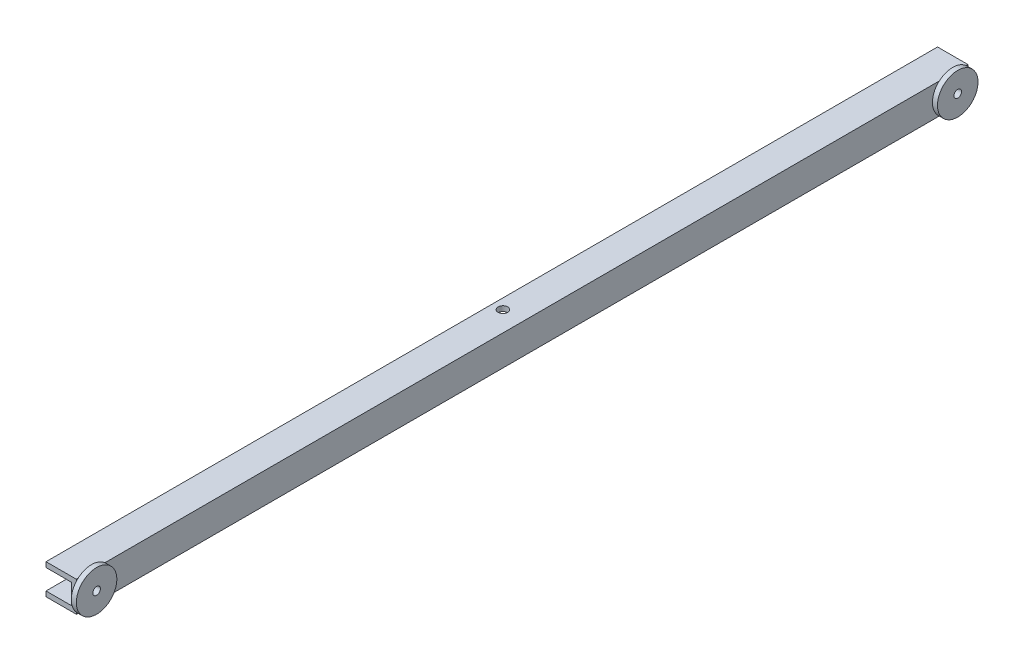
ISO-10303-21;
HEADER;
FILE_DESCRIPTION(('STEP AP214'),'2;1');
FILE_NAME('part.step','',(''),(''),'','','');
FILE_SCHEMA(('AUTOMOTIVE_DESIGN { 1 0 10303 214 1 1 1 1 }'));
ENDSEC;
DATA;
#1=APPLICATION_CONTEXT('core data for automotive mechanical design processes');
#2=APPLICATION_PROTOCOL_DEFINITION('international standard','automotive_design',2000,#1);
#3=PRODUCT_CONTEXT('',#1,'mechanical');
#4=PRODUCT('Part','Part','',(#3));
#5=PRODUCT_RELATED_PRODUCT_CATEGORY('part','',(#4));
#6=PRODUCT_DEFINITION_FORMATION('','',#4);
#7=PRODUCT_DEFINITION_CONTEXT('part definition',#1,'design');
#8=PRODUCT_DEFINITION('design','',#6,#7);
#9=PRODUCT_DEFINITION_SHAPE('','',#8);
#10=(LENGTH_UNIT() NAMED_UNIT(*) SI_UNIT(.MILLI.,.METRE.));
#11=(NAMED_UNIT(*) PLANE_ANGLE_UNIT() SI_UNIT($,.RADIAN.));
#12=(NAMED_UNIT(*) SI_UNIT($,.STERADIAN.) SOLID_ANGLE_UNIT());
#13=UNCERTAINTY_MEASURE_WITH_UNIT(LENGTH_MEASURE(1.E-05),#10,'distance_accuracy_value','');
#14=(GEOMETRIC_REPRESENTATION_CONTEXT(3) GLOBAL_UNCERTAINTY_ASSIGNED_CONTEXT((#13)) GLOBAL_UNIT_ASSIGNED_CONTEXT((#10,
#11,#12)) REPRESENTATION_CONTEXT('',''));
#15=CARTESIAN_POINT('',(0.,0.,0.));
#16=DIRECTION('',(0.,0.,1.));
#17=DIRECTION('',(1.,0.,0.));
#18=AXIS2_PLACEMENT_3D('',#15,#16,#17);
#19=CARTESIAN_POINT('',(0.,-9.525,-558.8));
#20=DIRECTION('',(1.,0.,0.));
#21=DIRECTION('',(0.,0.,-1.));
#22=AXIS2_PLACEMENT_3D('',#19,#20,#21);
#23=PLANE('',#22);
#24=DIRECTION('',(0.,1.,0.));
#25=VECTOR('',#24,1.);
#26=CARTESIAN_POINT('',(0.,-9.525,-558.8));
#27=LINE('',#26,#25);
#28=CARTESIAN_POINT('',(0.,-9.525,-558.8));
#29=VERTEX_POINT('',#28);
#30=CARTESIAN_POINT('',(0.,-8.40026041263005,-558.8));
#31=VERTEX_POINT('',#30);
#32=EDGE_CURVE('E152',#29,#31,#27,.T.);
#33=ORIENTED_EDGE('',*,*,#32,.T.);
#34=CARTESIAN_POINT('',(0.,0.,-549.275));
#35=DIRECTION('',(1.,0.,0.));
#36=DIRECTION('',(0.,0.,-1.));
#37=AXIS2_PLACEMENT_3D('',#34,#35,#36);
#38=CIRCLE('',#37,12.7);
#39=CARTESIAN_POINT('',(0.,-9.525,-557.67526041263));
#40=VERTEX_POINT('',#39);
#41=EDGE_CURVE('E175',#40,#31,#38,.T.);
#42=ORIENTED_EDGE('',*,*,#41,.F.);
#43=DIRECTION('',(0.,0.,1.));
#44=VECTOR('',#43,1.);
#45=CARTESIAN_POINT('',(0.,-9.525,-558.8));
#46=LINE('',#45,#44);
#47=EDGE_CURVE('E257',#29,#40,#46,.T.);
#48=ORIENTED_EDGE('',*,*,#47,.F.);
#49=EDGE_LOOP('',(#33,#42,#48));
#50=FACE_BOUND('',#49,.T.);
#51=ADVANCED_FACE('F37',(#50),#23,.T.);
#52=CARTESIAN_POINT('',(0.,-9.525,-540.87473958737));
#53=VERTEX_POINT('',#52);
#54=CARTESIAN_POINT('',(0.,-9.525,-17.9252604126301));
#55=VERTEX_POINT('',#54);
#56=EDGE_CURVE('E261',#53,#55,#46,.T.);
#57=ORIENTED_EDGE('',*,*,#56,.F.);
#58=CARTESIAN_POINT('',(0.,9.525,-540.87473958737));
#59=VERTEX_POINT('',#58);
#60=EDGE_CURVE('E55',#59,#53,#38,.T.);
#61=ORIENTED_EDGE('',*,*,#60,.F.);
#62=DIRECTION('',(0.,0.,1.));
#63=VECTOR('',#62,1.);
#64=CARTESIAN_POINT('',(0.,9.525,-558.8));
#65=LINE('',#64,#63);
#66=CARTESIAN_POINT('',(0.,9.525,-17.9252604126301));
#67=VERTEX_POINT('',#66);
#68=EDGE_CURVE('E255',#59,#67,#65,.T.);
#69=ORIENTED_EDGE('',*,*,#68,.T.);
#70=CARTESIAN_POINT('',(0.,0.,-9.525));
#71=DIRECTION('',(1.,0.,0.));
#72=DIRECTION('',(0.,0.,-1.));
#73=AXIS2_PLACEMENT_3D('',#70,#71,#72);
#74=CIRCLE('',#73,12.7);
#75=EDGE_CURVE('E196',#55,#67,#74,.T.);
#76=ORIENTED_EDGE('',*,*,#75,.F.);
#77=EDGE_LOOP('',(#57,#61,#69,#76));
#78=FACE_BOUND('',#77,.T.);
#79=ADVANCED_FACE('F313',(#78),#23,.T.);
#80=CARTESIAN_POINT('',(0.,9.525,-558.8));
#81=VERTEX_POINT('',#80);
#82=CARTESIAN_POINT('',(0.,9.525,-557.67526041263));
#83=VERTEX_POINT('',#82);
#84=EDGE_CURVE('E158',#81,#83,#65,.T.);
#85=ORIENTED_EDGE('',*,*,#84,.T.);
#86=CARTESIAN_POINT('',(0.,8.40026041263007,-558.8));
#87=VERTEX_POINT('',#86);
#88=EDGE_CURVE('E156',#87,#83,#38,.T.);
#89=ORIENTED_EDGE('',*,*,#88,.F.);
#90=EDGE_CURVE('E141',#87,#81,#27,.T.);
#91=ORIENTED_EDGE('',*,*,#90,.T.);
#92=EDGE_LOOP('',(#85,#89,#91));
#93=FACE_BOUND('',#92,.T.);
#94=ADVANCED_FACE('F157',(#93),#23,.T.);
#95=CARTESIAN_POINT('',(0.,9.525,-1.12473958736992));
#96=VERTEX_POINT('',#95);
#97=CARTESIAN_POINT('',(0.,8.40026041263008,0.));
#98=VERTEX_POINT('',#97);
#99=EDGE_CURVE('E11',#96,#98,#74,.T.);
#100=ORIENTED_EDGE('',*,*,#99,.F.);
#101=CARTESIAN_POINT('',(0.,9.525,0.));
#102=VERTEX_POINT('',#101);
#103=EDGE_CURVE('E260',#96,#102,#65,.T.);
#104=ORIENTED_EDGE('',*,*,#103,.T.);
#105=DIRECTION('',(0.,1.,0.));
#106=VECTOR('',#105,1.);
#107=CARTESIAN_POINT('',(0.,-9.525,0.));
#108=LINE('',#107,#106);
#109=EDGE_CURVE('E245',#98,#102,#108,.T.);
#110=ORIENTED_EDGE('',*,*,#109,.F.);
#111=EDGE_LOOP('',(#100,#104,#110));
#112=FACE_BOUND('',#111,.T.);
#113=ADVANCED_FACE('F311',(#112),#23,.T.);
#114=CARTESIAN_POINT('',(0.,-8.40026041263008,0.));
#115=VERTEX_POINT('',#114);
#116=CARTESIAN_POINT('',(0.,-9.525,-1.12473958736992));
#117=VERTEX_POINT('',#116);
#118=EDGE_CURVE('E46',#115,#117,#74,.T.);
#119=ORIENTED_EDGE('',*,*,#118,.F.);
#120=CARTESIAN_POINT('',(0.,-9.525,0.));
#121=VERTEX_POINT('',#120);
#122=EDGE_CURVE('E246',#121,#115,#108,.T.);
#123=ORIENTED_EDGE('',*,*,#122,.F.);
#124=EDGE_CURVE('E265',#117,#121,#46,.T.);
#125=ORIENTED_EDGE('',*,*,#124,.F.);
#126=EDGE_LOOP('',(#119,#123,#125));
#127=FACE_BOUND('',#126,.T.);
#128=ADVANCED_FACE('F342',(#127),#23,.T.);
#129=CARTESIAN_POINT('',(-19.01,9.525,-558.8));
#130=DIRECTION('',(-1.,0.,0.));
#131=DIRECTION('',(0.,-1.,0.));
#132=AXIS2_PLACEMENT_3D('',#129,#130,#131);
#133=PLANE('',#132);
#134=DIRECTION('',(0.,-1.,0.));
#135=VECTOR('',#134,1.);
#136=CARTESIAN_POINT('',(-19.01,9.525,0.));
#137=LINE('',#136,#135);
#138=CARTESIAN_POINT('',(-19.01,9.525,0.));
#139=VERTEX_POINT('',#138);
#140=CARTESIAN_POINT('',(-19.01,6.35,0.));
#141=VERTEX_POINT('',#140);
#142=EDGE_CURVE('E207',#139,#141,#137,.T.);
#143=ORIENTED_EDGE('',*,*,#142,.F.);
#144=DIRECTION('',(0.,0.,1.));
#145=VECTOR('',#144,1.);
#146=CARTESIAN_POINT('',(-19.01,9.525,-558.8));
#147=LINE('',#146,#145);
#148=CARTESIAN_POINT('',(-19.01,9.525,-558.8));
#149=VERTEX_POINT('',#148);
#150=EDGE_CURVE('E252',#149,#139,#147,.T.);
#151=ORIENTED_EDGE('',*,*,#150,.F.);
#152=DIRECTION('',(0.,-1.,0.));
#153=VECTOR('',#152,1.);
#154=CARTESIAN_POINT('',(-19.01,9.525,-558.8));
#155=LINE('',#154,#153);
#156=CARTESIAN_POINT('',(-19.01,6.35,-558.8));
#157=VERTEX_POINT('',#156);
#158=EDGE_CURVE('E208',#149,#157,#155,.T.);
#159=ORIENTED_EDGE('',*,*,#158,.T.);
#160=DIRECTION('',(0.,0.,1.));
#161=VECTOR('',#160,1.);
#162=CARTESIAN_POINT('',(-19.01,6.35,-558.8));
#163=LINE('',#162,#161);
#164=EDGE_CURVE('E227',#157,#141,#163,.T.);
#165=ORIENTED_EDGE('',*,*,#164,.T.);
#166=EDGE_LOOP('',(#143,#151,#159,#165));
#167=FACE_BOUND('',#166,.T.);
#168=ADVANCED_FACE('F39',(#167),#133,.T.);
#169=CARTESIAN_POINT('',(0.,9.525,-558.8));
#170=DIRECTION('',(0.,1.,0.));
#171=DIRECTION('',(0.,0.,1.));
#172=AXIS2_PLACEMENT_3D('',#169,#170,#171);
#173=PLANE('',#172);
#174=CARTESIAN_POINT('',(-12.66,9.525,-280.013576807965));
#175=DIRECTION('',(0.,1.,0.));
#176=DIRECTION('',(0.,0.,1.));
#177=AXIS2_PLACEMENT_3D('',#174,#175,#176);
#178=CIRCLE('',#177,3.);
#179=CARTESIAN_POINT('',(-12.66,9.525,-277.013576807965));
#180=VERTEX_POINT('',#179);
#181=EDGE_CURVE('E197',#180,#180,#178,.T.);
#182=ORIENTED_EDGE('',*,*,#181,.F.);
#183=EDGE_LOOP('',(#182));
#184=FACE_BOUND('',#183,.T.);
#185=DIRECTION('',(-1.,0.,0.));
#186=VECTOR('',#185,1.);
#187=CARTESIAN_POINT('',(0.,9.525,0.));
#188=LINE('',#187,#186);
#189=EDGE_CURVE('E212',#102,#139,#188,.T.);
#190=ORIENTED_EDGE('',*,*,#189,.F.);
#191=ORIENTED_EDGE('',*,*,#103,.F.);
#192=EDGE_CURVE('E256',#67,#96,#65,.T.);
#193=ORIENTED_EDGE('',*,*,#192,.F.);
#194=ORIENTED_EDGE('',*,*,#68,.F.);
#195=DIRECTION('',(0.,0.,-1.));
#196=VECTOR('',#195,1.);
#197=CARTESIAN_POINT('',(0.,9.525,-558.8));
#198=LINE('',#197,#196);
#199=EDGE_CURVE('E62',#59,#83,#198,.T.);
#200=ORIENTED_EDGE('',*,*,#199,.T.);
#201=ORIENTED_EDGE('',*,*,#84,.F.);
#202=DIRECTION('',(-1.,0.,0.));
#203=VECTOR('',#202,1.);
#204=CARTESIAN_POINT('',(0.,9.525,-558.8));
#205=LINE('',#204,#203);
#206=EDGE_CURVE('E150',#81,#149,#205,.T.);
#207=ORIENTED_EDGE('',*,*,#206,.T.);
#208=ORIENTED_EDGE('',*,*,#150,.T.);
#209=EDGE_LOOP('',(#190,#191,#193,#194,#200,#201,#207,#208));
#210=FACE_BOUND('',#209,.T.);
#211=ADVANCED_FACE('F302',(#184,#210),#173,.T.);
#212=CARTESIAN_POINT('',(0.,-9.525,-558.8));
#213=DIRECTION('',(0.,-1.,0.));
#214=DIRECTION('',(0.,0.,-1.));
#215=AXIS2_PLACEMENT_3D('',#212,#213,#214);
#216=PLANE('',#215);
#217=CARTESIAN_POINT('',(-12.66,-9.52500000000001,-280.013576807965));
#218=DIRECTION('',(0.,-1.,0.));
#219=DIRECTION('',(0.,0.,-1.));
#220=AXIS2_PLACEMENT_3D('',#217,#218,#219);
#221=CIRCLE('',#220,3.);
#222=CARTESIAN_POINT('',(-12.66,-9.52500000000001,-283.013576807965));
#223=VERTEX_POINT('',#222);
#224=EDGE_CURVE('E204',#223,#223,#221,.T.);
#225=ORIENTED_EDGE('',*,*,#224,.F.);
#226=EDGE_LOOP('',(#225));
#227=FACE_BOUND('',#226,.T.);
#228=DIRECTION('',(1.,0.,0.));
#229=VECTOR('',#228,1.);
#230=CARTESIAN_POINT('',(0.,-9.525,0.));
#231=LINE('',#230,#229);
#232=CARTESIAN_POINT('',(-19.01,-9.525,0.));
#233=VERTEX_POINT('',#232);
#234=EDGE_CURVE('E242',#233,#121,#231,.T.);
#235=ORIENTED_EDGE('',*,*,#234,.F.);
#236=DIRECTION('',(0.,0.,1.));
#237=VECTOR('',#236,1.);
#238=CARTESIAN_POINT('',(-19.01,-9.525,-558.8));
#239=LINE('',#238,#237);
#240=CARTESIAN_POINT('',(-19.01,-9.525,-558.8));
#241=VERTEX_POINT('',#240);
#242=EDGE_CURVE('E263',#241,#233,#239,.T.);
#243=ORIENTED_EDGE('',*,*,#242,.F.);
#244=DIRECTION('',(1.,0.,0.));
#245=VECTOR('',#244,1.);
#246=CARTESIAN_POINT('',(0.,-9.525,-558.8));
#247=LINE('',#246,#245);
#248=EDGE_CURVE('E153',#241,#29,#247,.T.);
#249=ORIENTED_EDGE('',*,*,#248,.T.);
#250=ORIENTED_EDGE('',*,*,#47,.T.);
#251=DIRECTION('',(0.,0.,1.));
#252=VECTOR('',#251,1.);
#253=CARTESIAN_POINT('',(0.,-9.525,-558.8));
#254=LINE('',#253,#252);
#255=EDGE_CURVE('E171',#40,#53,#254,.T.);
#256=ORIENTED_EDGE('',*,*,#255,.T.);
#257=ORIENTED_EDGE('',*,*,#56,.T.);
#258=EDGE_CURVE('E262',#55,#117,#46,.T.);
#259=ORIENTED_EDGE('',*,*,#258,.T.);
#260=ORIENTED_EDGE('',*,*,#124,.T.);
#261=EDGE_LOOP('',(#235,#243,#249,#250,#256,#257,#259,#260));
#262=FACE_BOUND('',#261,.T.);
#263=ADVANCED_FACE('F360',(#227,#262),#216,.T.);
#264=CARTESIAN_POINT('',(-19.01,-9.525,-558.8));
#265=DIRECTION('',(-1.,0.,0.));
#266=DIRECTION('',(0.,-1.,0.));
#267=AXIS2_PLACEMENT_3D('',#264,#265,#266);
#268=PLANE('',#267);
#269=DIRECTION('',(0.,-1.,0.));
#270=VECTOR('',#269,1.);
#271=CARTESIAN_POINT('',(-19.01,-9.525,0.));
#272=LINE('',#271,#270);
#273=CARTESIAN_POINT('',(-19.01,-6.35,0.));
#274=VERTEX_POINT('',#273);
#275=EDGE_CURVE('E239',#274,#233,#272,.T.);
#276=ORIENTED_EDGE('',*,*,#275,.F.);
#277=DIRECTION('',(0.,0.,1.));
#278=VECTOR('',#277,1.);
#279=CARTESIAN_POINT('',(-19.01,-6.35,-558.8));
#280=LINE('',#279,#278);
#281=CARTESIAN_POINT('',(-19.01,-6.35,-558.8));
#282=VERTEX_POINT('',#281);
#283=EDGE_CURVE('E266',#282,#274,#280,.T.);
#284=ORIENTED_EDGE('',*,*,#283,.F.);
#285=DIRECTION('',(0.,-1.,0.));
#286=VECTOR('',#285,1.);
#287=CARTESIAN_POINT('',(-19.01,-9.525,-558.8));
#288=LINE('',#287,#286);
#289=EDGE_CURVE('E221',#282,#241,#288,.T.);
#290=ORIENTED_EDGE('',*,*,#289,.T.);
#291=ORIENTED_EDGE('',*,*,#242,.T.);
#292=EDGE_LOOP('',(#276,#284,#290,#291));
#293=FACE_BOUND('',#292,.T.);
#294=ADVANCED_FACE('F414',(#293),#268,.T.);
#295=CARTESIAN_POINT('',(-19.01,-6.35,-558.8));
#296=DIRECTION('',(0.,1.,0.));
#297=DIRECTION('',(0.,0.,1.));
#298=AXIS2_PLACEMENT_3D('',#295,#296,#297);
#299=PLANE('',#298);
#300=CARTESIAN_POINT('',(-12.66,-6.34999999999997,-280.013576807965));
#301=DIRECTION('',(0.,1.,0.));
#302=DIRECTION('',(0.,0.,1.));
#303=AXIS2_PLACEMENT_3D('',#300,#301,#302);
#304=CIRCLE('',#303,3.);
#305=CARTESIAN_POINT('',(-12.66,-6.34999999999997,-277.013576807965));
#306=VERTEX_POINT('',#305);
#307=EDGE_CURVE('E201',#306,#306,#304,.T.);
#308=ORIENTED_EDGE('',*,*,#307,.F.);
#309=EDGE_LOOP('',(#308));
#310=FACE_BOUND('',#309,.T.);
#311=DIRECTION('',(-1.,0.,0.));
#312=VECTOR('',#311,1.);
#313=CARTESIAN_POINT('',(-19.01,-6.35,0.));
#314=LINE('',#313,#312);
#315=CARTESIAN_POINT('',(-3.175,-6.35,0.));
#316=VERTEX_POINT('',#315);
#317=EDGE_CURVE('E236',#316,#274,#314,.T.);
#318=ORIENTED_EDGE('',*,*,#317,.F.);
#319=DIRECTION('',(0.,0.,1.));
#320=VECTOR('',#319,1.);
#321=CARTESIAN_POINT('',(-3.175,-6.35,-558.8));
#322=LINE('',#321,#320);
#323=CARTESIAN_POINT('',(-3.175,-6.35,-558.8));
#324=VERTEX_POINT('',#323);
#325=EDGE_CURVE('E268',#324,#316,#322,.T.);
#326=ORIENTED_EDGE('',*,*,#325,.F.);
#327=DIRECTION('',(-1.,0.,0.));
#328=VECTOR('',#327,1.);
#329=CARTESIAN_POINT('',(-19.01,-6.35,-558.8));
#330=LINE('',#329,#328);
#331=EDGE_CURVE('E218',#324,#282,#330,.T.);
#332=ORIENTED_EDGE('',*,*,#331,.T.);
#333=ORIENTED_EDGE('',*,*,#283,.T.);
#334=EDGE_LOOP('',(#318,#326,#332,#333));
#335=FACE_BOUND('',#334,.T.);
#336=ADVANCED_FACE('F287',(#310,#335),#299,.T.);
#337=CARTESIAN_POINT('',(-3.175,6.35,-558.8));
#338=DIRECTION('',(-1.,0.,0.));
#339=DIRECTION('',(0.,0.,1.));
#340=AXIS2_PLACEMENT_3D('',#337,#338,#339);
#341=PLANE('',#340);
#342=CARTESIAN_POINT('',(-3.175,0.,-9.525));
#343=DIRECTION('',(-1.,0.,0.));
#344=DIRECTION('',(0.,0.,1.));
#345=AXIS2_PLACEMENT_3D('',#342,#343,#344);
#346=CIRCLE('',#345,2.38125);
#347=CARTESIAN_POINT('',(-3.175,0.,-7.14375));
#348=VERTEX_POINT('',#347);
#349=EDGE_CURVE('E41',#348,#348,#346,.T.);
#350=ORIENTED_EDGE('',*,*,#349,.F.);
#351=EDGE_LOOP('',(#350));
#352=FACE_BOUND('',#351,.T.);
#353=CARTESIAN_POINT('',(-3.175,0.,-549.275));
#354=DIRECTION('',(-1.,0.,0.));
#355=DIRECTION('',(0.,0.,1.));
#356=AXIS2_PLACEMENT_3D('',#353,#354,#355);
#357=CIRCLE('',#356,2.38125000000006);
#358=CARTESIAN_POINT('',(-3.175,0.,-546.89375));
#359=VERTEX_POINT('',#358);
#360=EDGE_CURVE('E192',#359,#359,#357,.T.);
#361=ORIENTED_EDGE('',*,*,#360,.F.);
#362=EDGE_LOOP('',(#361));
#363=FACE_BOUND('',#362,.T.);
#364=DIRECTION('',(0.,-1.,0.));
#365=VECTOR('',#364,1.);
#366=CARTESIAN_POINT('',(-3.175,6.35,0.));
#367=LINE('',#366,#365);
#368=CARTESIAN_POINT('',(-3.175,6.35,0.));
#369=VERTEX_POINT('',#368);
#370=EDGE_CURVE('E233',#369,#316,#367,.T.);
#371=ORIENTED_EDGE('',*,*,#370,.F.);
#372=DIRECTION('',(0.,0.,1.));
#373=VECTOR('',#372,1.);
#374=CARTESIAN_POINT('',(-3.175,6.35,-558.8));
#375=LINE('',#374,#373);
#376=CARTESIAN_POINT('',(-3.175,6.35,-558.8));
#377=VERTEX_POINT('',#376);
#378=EDGE_CURVE('E270',#377,#369,#375,.T.);
#379=ORIENTED_EDGE('',*,*,#378,.F.);
#380=DIRECTION('',(0.,-1.,0.));
#381=VECTOR('',#380,1.);
#382=CARTESIAN_POINT('',(-3.175,6.35,-558.8));
#383=LINE('',#382,#381);
#384=EDGE_CURVE('E215',#377,#324,#383,.T.);
#385=ORIENTED_EDGE('',*,*,#384,.T.);
#386=ORIENTED_EDGE('',*,*,#325,.T.);
#387=EDGE_LOOP('',(#371,#379,#385,#386));
#388=FACE_BOUND('',#387,.T.);
#389=ADVANCED_FACE('F283',(#352,#363,#388),#341,.T.);
#390=CARTESIAN_POINT('',(-19.01,6.35,-558.8));
#391=DIRECTION('',(0.,-1.,0.));
#392=DIRECTION('',(0.,0.,-1.));
#393=AXIS2_PLACEMENT_3D('',#390,#391,#392);
#394=PLANE('',#393);
#395=CARTESIAN_POINT('',(-12.66,6.34999999999997,-280.013576807965));
#396=DIRECTION('',(0.,-1.,0.));
#397=DIRECTION('',(0.,0.,-1.));
#398=AXIS2_PLACEMENT_3D('',#395,#396,#397);
#399=CIRCLE('',#398,3.);
#400=CARTESIAN_POINT('',(-12.66,6.34999999999997,-283.013576807965));
#401=VERTEX_POINT('',#400);
#402=EDGE_CURVE('E200',#401,#401,#399,.T.);
#403=ORIENTED_EDGE('',*,*,#402,.F.);
#404=EDGE_LOOP('',(#403));
#405=FACE_BOUND('',#404,.T.);
#406=DIRECTION('',(1.,0.,0.));
#407=VECTOR('',#406,1.);
#408=CARTESIAN_POINT('',(-19.01,6.35,0.));
#409=LINE('',#408,#407);
#410=EDGE_CURVE('E230',#141,#369,#409,.T.);
#411=ORIENTED_EDGE('',*,*,#410,.F.);
#412=ORIENTED_EDGE('',*,*,#164,.F.);
#413=DIRECTION('',(1.,0.,0.));
#414=VECTOR('',#413,1.);
#415=CARTESIAN_POINT('',(-19.01,6.35,-558.8));
#416=LINE('',#415,#414);
#417=EDGE_CURVE('E211',#157,#377,#416,.T.);
#418=ORIENTED_EDGE('',*,*,#417,.T.);
#419=ORIENTED_EDGE('',*,*,#378,.T.);
#420=EDGE_LOOP('',(#411,#412,#418,#419));
#421=FACE_BOUND('',#420,.T.);
#422=ADVANCED_FACE('F286',(#405,#421),#394,.T.);
#423=CARTESIAN_POINT('',(0.,0.,-558.8));
#424=DIRECTION('',(0.,0.,1.));
#425=DIRECTION('',(1.,0.,0.));
#426=AXIS2_PLACEMENT_3D('',#423,#424,#425);
#427=PLANE('',#426);
#428=ORIENTED_EDGE('',*,*,#158,.F.);
#429=ORIENTED_EDGE('',*,*,#206,.F.);
#430=ORIENTED_EDGE('',*,*,#90,.F.);
#431=DIRECTION('',(0.,1.,0.));
#432=VECTOR('',#431,1.);
#433=CARTESIAN_POINT('',(0.,0.,-558.8));
#434=LINE('',#433,#432);
#435=EDGE_CURVE('E147',#31,#87,#434,.T.);
#436=ORIENTED_EDGE('',*,*,#435,.F.);
#437=ORIENTED_EDGE('',*,*,#32,.F.);
#438=ORIENTED_EDGE('',*,*,#248,.F.);
#439=ORIENTED_EDGE('',*,*,#289,.F.);
#440=ORIENTED_EDGE('',*,*,#331,.F.);
#441=ORIENTED_EDGE('',*,*,#384,.F.);
#442=ORIENTED_EDGE('',*,*,#417,.F.);
#443=EDGE_LOOP('',(#428,#429,#430,#436,#437,#438,#439,#440,#441,#442));
#444=FACE_BOUND('',#443,.T.);
#445=ADVANCED_FACE('F144',(#444),#427,.F.);
#446=CARTESIAN_POINT('',(0.,0.,0.));
#447=DIRECTION('',(0.,0.,1.));
#448=DIRECTION('',(1.,0.,0.));
#449=AXIS2_PLACEMENT_3D('',#446,#447,#448);
#450=PLANE('',#449);
#451=ORIENTED_EDGE('',*,*,#142,.T.);
#452=ORIENTED_EDGE('',*,*,#410,.T.);
#453=ORIENTED_EDGE('',*,*,#370,.T.);
#454=ORIENTED_EDGE('',*,*,#317,.T.);
#455=ORIENTED_EDGE('',*,*,#275,.T.);
#456=ORIENTED_EDGE('',*,*,#234,.T.);
#457=ORIENTED_EDGE('',*,*,#122,.T.);
#458=EDGE_CURVE('E249',#115,#98,#108,.T.);
#459=ORIENTED_EDGE('',*,*,#458,.T.);
#460=ORIENTED_EDGE('',*,*,#109,.T.);
#461=ORIENTED_EDGE('',*,*,#189,.T.);
#462=EDGE_LOOP('',(#451,#452,#453,#454,#455,#456,#457,#459,#460,#461));
#463=FACE_BOUND('',#462,.T.);
#464=ADVANCED_FACE('F295',(#463),#450,.T.);
#465=CARTESIAN_POINT('',(-12.66,-549.275,-280.013576807965));
#466=DIRECTION('',(0.,1.,0.));
#467=DIRECTION('',(0.,0.,1.));
#468=AXIS2_PLACEMENT_3D('',#465,#466,#467);
#469=CYLINDRICAL_SURFACE('',#468,3.);
#470=ORIENTED_EDGE('',*,*,#402,.T.);
#471=EDGE_LOOP('',(#470));
#472=FACE_BOUND('',#471,.T.);
#473=ORIENTED_EDGE('',*,*,#181,.T.);
#474=EDGE_LOOP('',(#473));
#475=FACE_BOUND('',#474,.T.);
#476=ADVANCED_FACE('F400',(#472,#475),#469,.F.);
#477=ORIENTED_EDGE('',*,*,#224,.T.);
#478=EDGE_LOOP('',(#477));
#479=FACE_BOUND('',#478,.T.);
#480=ORIENTED_EDGE('',*,*,#307,.T.);
#481=EDGE_LOOP('',(#480));
#482=FACE_BOUND('',#481,.T.);
#483=ADVANCED_FACE('F393',(#479,#482),#469,.F.);
#484=CARTESIAN_POINT('',(-6.79999999999969,0.,-549.275));
#485=DIRECTION('',(1.,0.,0.));
#486=DIRECTION('',(0.,0.,-1.));
#487=AXIS2_PLACEMENT_3D('',#484,#485,#486);
#488=CYLINDRICAL_SURFACE('',#487,2.38125000000006);
#489=ORIENTED_EDGE('',*,*,#360,.T.);
#490=EDGE_LOOP('',(#489));
#491=FACE_BOUND('',#490,.T.);
#492=CARTESIAN_POINT('',(3.175,0.,-549.275));
#493=DIRECTION('',(1.,0.,0.));
#494=DIRECTION('',(0.,0.,-1.));
#495=AXIS2_PLACEMENT_3D('',#492,#493,#494);
#496=CIRCLE('',#495,2.38125000000007);
#497=CARTESIAN_POINT('',(3.175,0.,-551.65625));
#498=VERTEX_POINT('',#497);
#499=EDGE_CURVE('E163',#498,#498,#496,.T.);
#500=ORIENTED_EDGE('',*,*,#499,.T.);
#501=EDGE_LOOP('',(#500));
#502=FACE_BOUND('',#501,.T.);
#503=ADVANCED_FACE('F391',(#491,#502),#488,.F.);
#504=CARTESIAN_POINT('',(-6.79999999999969,0.,-9.525));
#505=DIRECTION('',(1.,0.,0.));
#506=DIRECTION('',(0.,0.,-1.));
#507=AXIS2_PLACEMENT_3D('',#504,#505,#506);
#508=CYLINDRICAL_SURFACE('',#507,2.38125);
#509=ORIENTED_EDGE('',*,*,#349,.T.);
#510=EDGE_LOOP('',(#509));
#511=FACE_BOUND('',#510,.T.);
#512=CARTESIAN_POINT('',(3.175,0.,-9.525));
#513=DIRECTION('',(1.,0.,0.));
#514=DIRECTION('',(0.,0.,-1.));
#515=AXIS2_PLACEMENT_3D('',#512,#513,#514);
#516=CIRCLE('',#515,2.38125);
#517=CARTESIAN_POINT('',(3.175,0.,-11.90625));
#518=VERTEX_POINT('',#517);
#519=EDGE_CURVE('E186',#518,#518,#516,.T.);
#520=ORIENTED_EDGE('',*,*,#519,.T.);
#521=EDGE_LOOP('',(#520));
#522=FACE_BOUND('',#521,.T.);
#523=ADVANCED_FACE('F280',(#511,#522),#508,.F.);
#524=CARTESIAN_POINT('',(0.,0.,-9.525));
#525=DIRECTION('',(1.,0.,0.));
#526=DIRECTION('',(0.,0.,-1.));
#527=AXIS2_PLACEMENT_3D('',#524,#525,#526);
#528=PLANE('',#527);
#529=ORIENTED_EDGE('',*,*,#458,.F.);
#530=EDGE_CURVE('E48',#98,#115,#74,.T.);
#531=ORIENTED_EDGE('',*,*,#530,.F.);
#532=EDGE_LOOP('',(#529,#531));
#533=FACE_BOUND('',#532,.T.);
#534=ADVANCED_FACE('F326',(#533),#528,.F.);
#535=EDGE_CURVE('E193',#67,#96,#74,.T.);
#536=ORIENTED_EDGE('',*,*,#535,.F.);
#537=ORIENTED_EDGE('',*,*,#192,.T.);
#538=EDGE_LOOP('',(#536,#537));
#539=FACE_BOUND('',#538,.T.);
#540=ADVANCED_FACE('F323',(#539),#528,.F.);
#541=CARTESIAN_POINT('',(3.175,0.,-9.525));
#542=DIRECTION('',(1.,0.,0.));
#543=DIRECTION('',(0.,0.,-1.));
#544=AXIS2_PLACEMENT_3D('',#541,#542,#543);
#545=PLANE('',#544);
#546=CARTESIAN_POINT('',(3.175,0.,-9.525));
#547=DIRECTION('',(1.,0.,0.));
#548=DIRECTION('',(0.,0.,-1.));
#549=AXIS2_PLACEMENT_3D('',#546,#547,#548);
#550=CIRCLE('',#549,12.7);
#551=CARTESIAN_POINT('',(3.175,0.,-22.225));
#552=VERTEX_POINT('',#551);
#553=EDGE_CURVE('E190',#552,#552,#550,.T.);
#554=ORIENTED_EDGE('',*,*,#553,.T.);
#555=EDGE_LOOP('',(#554));
#556=FACE_BOUND('',#555,.T.);
#557=ORIENTED_EDGE('',*,*,#519,.F.);
#558=EDGE_LOOP('',(#557));
#559=FACE_BOUND('',#558,.T.);
#560=ADVANCED_FACE('F325',(#556,#559),#545,.T.);
#561=ORIENTED_EDGE('',*,*,#258,.F.);
#562=EDGE_CURVE('E189',#117,#55,#74,.T.);
#563=ORIENTED_EDGE('',*,*,#562,.F.);
#564=EDGE_LOOP('',(#561,#563));
#565=FACE_BOUND('',#564,.T.);
#566=ADVANCED_FACE('F328',(#565),#528,.F.);
#567=CARTESIAN_POINT('',(3.175,0.,-9.525));
#568=DIRECTION('',(-1.,0.,0.));
#569=DIRECTION('',(0.,0.,1.));
#570=AXIS2_PLACEMENT_3D('',#567,#568,#569);
#571=CYLINDRICAL_SURFACE('',#570,12.7);
#572=ORIENTED_EDGE('',*,*,#553,.F.);
#573=EDGE_LOOP('',(#572));
#574=FACE_BOUND('',#573,.T.);
#575=ORIENTED_EDGE('',*,*,#535,.T.);
#576=ORIENTED_EDGE('',*,*,#99,.T.);
#577=ORIENTED_EDGE('',*,*,#530,.T.);
#578=ORIENTED_EDGE('',*,*,#118,.T.);
#579=ORIENTED_EDGE('',*,*,#562,.T.);
#580=ORIENTED_EDGE('',*,*,#75,.T.);
#581=EDGE_LOOP('',(#575,#576,#577,#578,#579,#580));
#582=FACE_BOUND('',#581,.T.);
#583=ADVANCED_FACE('F320',(#574,#582),#571,.T.);
#584=CARTESIAN_POINT('',(0.,0.,-549.275));
#585=DIRECTION('',(1.,0.,0.));
#586=DIRECTION('',(0.,0.,-1.));
#587=AXIS2_PLACEMENT_3D('',#584,#585,#586);
#588=PLANE('',#587);
#589=ORIENTED_EDGE('',*,*,#199,.F.);
#590=EDGE_CURVE('E164',#83,#59,#38,.T.);
#591=ORIENTED_EDGE('',*,*,#590,.F.);
#592=EDGE_LOOP('',(#589,#591));
#593=FACE_BOUND('',#592,.T.);
#594=ADVANCED_FACE('F367',(#593),#588,.F.);
#595=EDGE_CURVE('E166',#31,#87,#38,.T.);
#596=ORIENTED_EDGE('',*,*,#595,.F.);
#597=ORIENTED_EDGE('',*,*,#435,.T.);
#598=EDGE_LOOP('',(#596,#597));
#599=FACE_BOUND('',#598,.T.);
#600=ADVANCED_FACE('F169',(#599),#588,.F.);
#601=CARTESIAN_POINT('',(3.175,0.,-549.275));
#602=DIRECTION('',(1.,0.,0.));
#603=DIRECTION('',(0.,0.,-1.));
#604=AXIS2_PLACEMENT_3D('',#601,#602,#603);
#605=PLANE('',#604);
#606=CARTESIAN_POINT('',(3.175,0.,-549.275));
#607=DIRECTION('',(1.,0.,0.));
#608=DIRECTION('',(0.,0.,-1.));
#609=AXIS2_PLACEMENT_3D('',#606,#607,#608);
#610=CIRCLE('',#609,12.7);
#611=CARTESIAN_POINT('',(3.175,0.,-561.975));
#612=VERTEX_POINT('',#611);
#613=EDGE_CURVE('E176',#612,#612,#610,.T.);
#614=ORIENTED_EDGE('',*,*,#613,.T.);
#615=EDGE_LOOP('',(#614));
#616=FACE_BOUND('',#615,.T.);
#617=ORIENTED_EDGE('',*,*,#499,.F.);
#618=EDGE_LOOP('',(#617));
#619=FACE_BOUND('',#618,.T.);
#620=ADVANCED_FACE('F374',(#616,#619),#605,.T.);
#621=ORIENTED_EDGE('',*,*,#255,.F.);
#622=EDGE_CURVE('E177',#53,#40,#38,.T.);
#623=ORIENTED_EDGE('',*,*,#622,.F.);
#624=EDGE_LOOP('',(#621,#623));
#625=FACE_BOUND('',#624,.T.);
#626=ADVANCED_FACE('F365',(#625),#588,.F.);
#627=CARTESIAN_POINT('',(3.175,0.,-549.275));
#628=DIRECTION('',(-1.,0.,0.));
#629=DIRECTION('',(0.,0.,1.));
#630=AXIS2_PLACEMENT_3D('',#627,#628,#629);
#631=CYLINDRICAL_SURFACE('',#630,12.7);
#632=ORIENTED_EDGE('',*,*,#613,.F.);
#633=EDGE_LOOP('',(#632));
#634=FACE_BOUND('',#633,.T.);
#635=ORIENTED_EDGE('',*,*,#88,.T.);
#636=ORIENTED_EDGE('',*,*,#590,.T.);
#637=ORIENTED_EDGE('',*,*,#60,.T.);
#638=ORIENTED_EDGE('',*,*,#622,.T.);
#639=ORIENTED_EDGE('',*,*,#41,.T.);
#640=ORIENTED_EDGE('',*,*,#595,.T.);
#641=EDGE_LOOP('',(#635,#636,#637,#638,#639,#640));
#642=FACE_BOUND('',#641,.T.);
#643=ADVANCED_FACE('F173',(#634,#642),#631,.T.);
#644=CLOSED_SHELL('',(#51,#79,#94,#113,#128,#168,#211,#263,#294,#336,#389,#422,#445,#464,#476,
#483,#503,#523,#534,#540,#560,#566,#583,#594,#600,#620,#626,#643));
#645=MANIFOLD_SOLID_BREP('B2',#644);
#646=ADVANCED_BREP_SHAPE_REPRESENTATION('',(#18,#645),#14);
#647=SHAPE_DEFINITION_REPRESENTATION(#9,#646);
ENDSEC;
END-ISO-10303-21;
